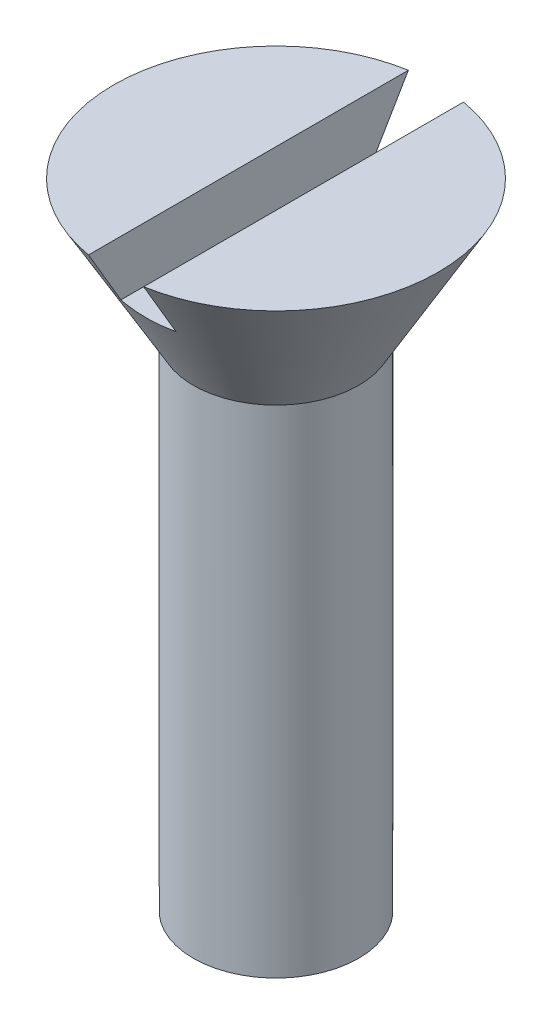
ISO-10303-21;
HEADER;
FILE_DESCRIPTION(('STEP AP214'),'2;1');
FILE_NAME('part.step','',(''),(''),'','','');
FILE_SCHEMA(('AUTOMOTIVE_DESIGN { 1 0 10303 214 1 1 1 1 }'));
ENDSEC;
DATA;
#1=APPLICATION_CONTEXT('core data for automotive mechanical design processes');
#2=APPLICATION_PROTOCOL_DEFINITION('international standard','automotive_design',2000,#1);
#3=PRODUCT_CONTEXT('',#1,'mechanical');
#4=PRODUCT('Part','Part','',(#3));
#5=PRODUCT_RELATED_PRODUCT_CATEGORY('part','',(#4));
#6=PRODUCT_DEFINITION_FORMATION('','',#4);
#7=PRODUCT_DEFINITION_CONTEXT('part definition',#1,'design');
#8=PRODUCT_DEFINITION('design','',#6,#7);
#9=PRODUCT_DEFINITION_SHAPE('','',#8);
#10=(LENGTH_UNIT() NAMED_UNIT(*) SI_UNIT(.MILLI.,.METRE.));
#11=(NAMED_UNIT(*) PLANE_ANGLE_UNIT() SI_UNIT($,.RADIAN.));
#12=(NAMED_UNIT(*) SI_UNIT($,.STERADIAN.) SOLID_ANGLE_UNIT());
#13=UNCERTAINTY_MEASURE_WITH_UNIT(LENGTH_MEASURE(1.E-05),#10,'distance_accuracy_value','');
#14=(GEOMETRIC_REPRESENTATION_CONTEXT(3) GLOBAL_UNCERTAINTY_ASSIGNED_CONTEXT((#13)) GLOBAL_UNIT_ASSIGNED_CONTEXT((#10,
#11,#12)) REPRESENTATION_CONTEXT('',''));
#15=CARTESIAN_POINT('',(0.,0.,0.));
#16=DIRECTION('',(0.,0.,1.));
#17=DIRECTION('',(1.,0.,0.));
#18=AXIS2_PLACEMENT_3D('',#15,#16,#17);
#19=CARTESIAN_POINT('',(0.,23.0000000000002,1.87350135405495E-13));
#20=DIRECTION('',(0.,-1.,0.));
#21=DIRECTION('',(0.,0.,-1.00000000000001));
#22=AXIS2_PLACEMENT_3D('',#19,#20,#21);
#23=PLANE('',#22);
#24=DIRECTION('',(0.,0.,-1.00000000000001));
#25=VECTOR('',#24,1.);
#26=CARTESIAN_POINT('',(-1.,23.0000000000002,5.88775134594868));
#27=LINE('',#26,#25);
#28=CARTESIAN_POINT('',(-1.00000000000006,23.0000000000002,5.80119310220128));
#29=VERTEX_POINT('',#28);
#30=CARTESIAN_POINT('',(-1.00000000000003,23.0000000000002,-5.80119310220077));
#31=VERTEX_POINT('',#30);
#32=EDGE_CURVE('E149',#29,#31,#27,.T.);
#33=ORIENTED_EDGE('',*,*,#32,.T.);
#34=CARTESIAN_POINT('',(0.,23.0000000000002,1.87350135405495E-13));
#35=DIRECTION('',(0.,-1.,0.));
#36=DIRECTION('',(0.,0.,-1.00000000000001));
#37=AXIS2_PLACEMENT_3D('',#34,#35,#36);
#38=CIRCLE('',#37,5.88675134594816);
#39=EDGE_CURVE('E51',#29,#31,#38,.T.);
#40=ORIENTED_EDGE('',*,*,#39,.F.);
#41=EDGE_LOOP('',(#33,#40));
#42=FACE_BOUND('',#41,.T.);
#43=ADVANCED_FACE('F42',(#42),#23,.F.);
#44=DIRECTION('',(0.,0.,-1.00000000000001));
#45=VECTOR('',#44,1.);
#46=CARTESIAN_POINT('',(1.,23.0000000000002,5.88775134594818));
#47=LINE('',#46,#45);
#48=CARTESIAN_POINT('',(0.999999999999945,23.0000000000002,5.80119310220131));
#49=VERTEX_POINT('',#48);
#50=CARTESIAN_POINT('',(1.,23.0000000000002,-5.80119310220081));
#51=VERTEX_POINT('',#50);
#52=EDGE_CURVE('E169',#49,#51,#47,.T.);
#53=ORIENTED_EDGE('',*,*,#52,.F.);
#54=EDGE_CURVE('E11',#51,#49,#38,.T.);
#55=ORIENTED_EDGE('',*,*,#54,.F.);
#56=EDGE_LOOP('',(#53,#55));
#57=FACE_BOUND('',#56,.T.);
#58=ADVANCED_FACE('F160',(#57),#23,.F.);
#59=CARTESIAN_POINT('',(0.,23.0000000000002,1.87350135405495E-13));
#60=DIRECTION('',(0.,1.,0.));
#61=DIRECTION('',(0.,0.,1.00000000000001));
#62=AXIS2_PLACEMENT_3D('',#59,#60,#61);
#63=CONICAL_SURFACE('',#62,5.88675134594816,0.523598775598304);
#64=CARTESIAN_POINT('',(0.,18.0000000000002,2.4980018054066E-13));
#65=DIRECTION('',(0.,-1.,0.));
#66=DIRECTION('',(0.,0.,-1.00000000000001));
#67=AXIS2_PLACEMENT_3D('',#64,#65,#66);
#68=CIRCLE('',#67,3.);
#69=CARTESIAN_POINT('',(0.,18.0000000000002,-2.99999999999978));
#70=VERTEX_POINT('',#69);
#71=EDGE_CURVE('E179',#70,#70,#68,.T.);
#72=ORIENTED_EDGE('',*,*,#71,.F.);
#73=EDGE_LOOP('',(#72));
#74=FACE_BOUND('',#73,.T.);
#75=CARTESIAN_POINT('',(-1.,15.9496756596478,-1.51616119676508));
#76=CARTESIAN_POINT('',(-1.00000000000002,16.0327629146096,-1.57359780048831));
#77=CARTESIAN_POINT('',(-1.00000000000003,16.1162823428286,-1.63040165709741));
#78=CARTESIAN_POINT('',(-1.00000000000003,16.2840014722308,-1.74298737685897));
#79=CARTESIAN_POINT('',(-1.00000000000003,16.3682011367729,-1.79876929453646));
#80=CARTESIAN_POINT('',(-1.00000000000003,16.5370934659947,-1.90955277492892));
#81=CARTESIAN_POINT('',(-1.00000000000003,16.621786058128,-1.96455444857528));
#82=CARTESIAN_POINT('',(-1.00000000000003,16.7915700027728,-2.07394123613671));
#83=CARTESIAN_POINT('',(-1.00000000000003,16.8766613614525,-2.12832634046981));
#84=CARTESIAN_POINT('',(-1.00000000000003,17.1323608111724,-2.29071800569782));
#85=CARTESIAN_POINT('',(-1.00000000000003,17.3034362756913,-2.39798827642144));
#86=CARTESIAN_POINT('',(-1.00000000000002,17.6464199600684,-2.61120240079285));
#87=CARTESIAN_POINT('',(-1.00000000000001,17.818328217885,-2.71714619317612));
#88=CARTESIAN_POINT('',(-0.99999999999999,18.319968605053,-3.02442281167239));
#89=CARTESIAN_POINT('',(-1.00000000000002,18.6504616079534,-3.224512420476));
#90=CARTESIAN_POINT('',(-1.00000000000004,19.3126034467591,-3.62275383145657));
#91=CARTESIAN_POINT('',(-1.00000000000003,19.6442522697673,-3.8209056551631));
#92=CARTESIAN_POINT('',(-1.00000000000003,20.3083559326735,-4.21602017403517));
#93=CARTESIAN_POINT('',(-1.00000000000003,20.6408109336901,-4.41298259829825));
#94=CARTESIAN_POINT('',(-1.00000000000002,21.3062081570767,-4.80608291276744));
#95=CARTESIAN_POINT('',(-1.00000000000001,21.6391503801146,-5.00222080184189));
#96=CARTESIAN_POINT('',(-0.999999999999994,22.4793870502628,-5.49623067311098));
#97=CARTESIAN_POINT('',(-1.00000000000002,22.9869044769734,-5.79372329827912));
#98=CARTESIAN_POINT('',(-1.00000000000004,24.002424590804,-6.38787852304444));
#99=CARTESIAN_POINT('',(-1.00000000000003,24.510427277952,-6.68454112259353));
#100=CARTESIAN_POINT('',(-1.00000000000003,25.5265427650815,-7.27718598575024));
#101=CARTESIAN_POINT('',(-1.00000000000003,26.0346554287458,-7.57316848313507));
#102=CARTESIAN_POINT('',(-1.00000000000003,27.0511133965292,-8.16473197677385));
#103=CARTESIAN_POINT('',(-1.00000000000002,27.5594587002866,-8.46031297364932));
#104=CARTESIAN_POINT('',(-1.,28.067875580662,-8.75577049508139));
#105=B_SPLINE_CURVE_WITH_KNOTS('',3,(#75,#76,#77,#78,#79,#80,#81,#82,#83,#84,#85,#86,#87,#88,
#89,#90,#91,#92,#93,#94,#95,#96,#97,#98,#99,#100,#101,#102,#103,#104),.UNSPECIFIED.,.F.,.F.,(4,
2,2,2,2,2,2,2,2,2,2,2,2,2,4),(0.,0.303012528315231,0.606008842185855,0.908961636788286,
1.21191913307806,1.81768376416724,2.42347627056562,3.58249286182722,4.74149656128886,
5.90075497241861,7.0600149740959,8.82485972986029,10.5897045878432,12.353806706096,
14.1179060903449),.UNSPECIFIED.);
#106=CARTESIAN_POINT('',(-1.,21.0000000000002,-4.62518160134425));
#107=VERTEX_POINT('',#106);
#108=EDGE_CURVE('E87',#107,#31,#105,.T.);
#109=ORIENTED_EDGE('',*,*,#108,.F.);
#110=CARTESIAN_POINT('',(0.,21.0000000000002,1.87350135405495E-13));
#111=DIRECTION('',(0.,-1.,0.));
#112=DIRECTION('',(0.,0.,-1.00000000000001));
#113=AXIS2_PLACEMENT_3D('',#110,#111,#112);
#114=CIRCLE('',#113,4.7320508075689);
#115=CARTESIAN_POINT('',(0.999999999999973,21.0000000000002,-4.6251816013442));
#116=VERTEX_POINT('',#115);
#117=EDGE_CURVE('E97',#116,#107,#114,.F.);
#118=ORIENTED_EDGE('',*,*,#117,.F.);
#119=CARTESIAN_POINT('',(1.,28.067875580662,-8.75577049508135));
#120=CARTESIAN_POINT('',(1.,27.5593175975708,-8.46023091691073));
#121=CARTESIAN_POINT('',(1.,27.0508311922605,-8.1645678559677));
#122=CARTESIAN_POINT('',(0.999999999999999,26.0341049048945,-7.57284796148646));
#123=CARTESIAN_POINT('',(0.999999999999997,25.5258650168923,-7.27679113816481));
#124=CARTESIAN_POINT('',(1.,24.5097632106478,-6.68415336457007));
#125=CARTESIAN_POINT('',(1.00000000000001,24.0019012579843,-6.38757247332671));
#126=CARTESIAN_POINT('',(0.99999999999999,22.9866493206126,-5.79357387036507));
#127=CARTESIAN_POINT('',(0.999999999999961,22.4792593481477,-5.49615613770236));
#128=CARTESIAN_POINT('',(0.999999999999979,21.718712506226,-5.04899839161846));
#129=CARTESIAN_POINT('',(0.999999999999995,21.4652613381778,-4.89975902236174));
#130=CARTESIAN_POINT('',(1.00000000000001,20.958620577571,-4.60083985677453));
#131=CARTESIAN_POINT('',(1.,20.705430983616,-4.45116006281192));
#132=CARTESIAN_POINT('',(1.,20.1994175083831,-4.15122139482165));
#133=CARTESIAN_POINT('',(1.,19.9465936040251,-4.00096255974822));
#134=CARTESIAN_POINT('',(1.,19.44142534405,-3.69962884314));
#135=CARTESIAN_POINT('',(1.,19.1890809979019,-3.54855394571358));
#136=CARTESIAN_POINT('',(1.,18.6850400625906,-3.24519819643722));
#137=CARTESIAN_POINT('',(1.,18.4333436327135,-3.09291707975157));
#138=CARTESIAN_POINT('',(1.,17.9310343004248,-2.78660173237247));
#139=CARTESIAN_POINT('',(1.,17.6804213401659,-2.63256759690989));
#140=CARTESIAN_POINT('',(1.,17.3058203422291,-2.3993231030763));
#141=CARTESIAN_POINT('',(1.,17.1811566927625,-2.32119891872858));
#142=CARTESIAN_POINT('',(1.,16.9324471478238,-2.16397973206947));
#143=CARTESIAN_POINT('',(1.,16.8084012352013,-2.08488475692382));
#144=CARTESIAN_POINT('',(1.,16.5611344818107,-1.92535916429907));
#145=CARTESIAN_POINT('',(1.,16.4379138026702,-1.8449282953259));
#146=CARTESIAN_POINT('',(1.,16.2540114320586,-1.7228690949358));
#147=CARTESIAN_POINT('',(1.00000000000001,16.1928625584043,-1.68194525126271));
#148=CARTESIAN_POINT('',(0.999999999999999,16.0709554466598,-1.599516384573));
#149=CARTESIAN_POINT('',(0.999999999999992,16.0101972200434,-1.55801134459863));
#150=CARTESIAN_POINT('',(0.999999999999973,15.9496756596478,-1.51616119676503));
#151=B_SPLINE_CURVE_WITH_KNOTS('',3,(#119,#120,#121,#122,#123,#124,#125,#126,#127,#128,#129,
#130,#131,#132,#133,#134,#135,#136,#137,#138,#139,#140,#141,#142,#143,#144,#145,#146,#147,#148,
#149,#150),.UNSPECIFIED.,.F.,.F.,(4,2,2,2,2,2,2,2,2,2,2,2,2,2,2,4),(0.,1.76458907261376,
3.52913322112413,5.29348988969741,7.05789111643699,7.94026767900738,8.82263950626304,
9.70495297478999,10.5872836874806,11.469813811798,12.3522962203107,12.7936541152619,
13.2349996876815,13.6764293109375,13.8971649160787,14.1179069751704),.UNSPECIFIED.);
#152=EDGE_CURVE('E108',#51,#116,#151,.T.);
#153=ORIENTED_EDGE('',*,*,#152,.F.);
#154=ORIENTED_EDGE('',*,*,#54,.T.);
#155=CARTESIAN_POINT('',(1.,28.0678755806616,8.7557704950814));
#156=CARTESIAN_POINT('',(1.,27.5593175975704,8.46023091691085));
#157=CARTESIAN_POINT('',(1.,27.0508311922601,8.16456785596784));
#158=CARTESIAN_POINT('',(0.999999999999999,26.0341049048942,7.57284796148663));
#159=CARTESIAN_POINT('',(0.999999999999997,25.525865016892,7.27679113816499));
#160=CARTESIAN_POINT('',(1.,24.5097632106476,6.68415336457031));
#161=CARTESIAN_POINT('',(1.00000000000001,24.001901257984,6.38757247332702));
#162=CARTESIAN_POINT('',(0.99999999999999,22.9866493206124,5.79357387036527));
#163=CARTESIAN_POINT('',(0.999999999999961,22.4792593481477,5.49615613770239));
#164=CARTESIAN_POINT('',(0.999999999999979,21.7187125062259,5.04899839161863));
#165=CARTESIAN_POINT('',(0.999999999999995,21.4652613381777,4.89975902236201));
#166=CARTESIAN_POINT('',(1.00000000000001,20.9586205775709,4.60083985677488));
#167=CARTESIAN_POINT('',(1.,20.7054309836158,4.45116006281223));
#168=CARTESIAN_POINT('',(1.,20.199417508383,4.15122139482195));
#169=CARTESIAN_POINT('',(1.,19.946593604025,4.00096255974853));
#170=CARTESIAN_POINT('',(1.,19.4414253440499,3.69962884314031));
#171=CARTESIAN_POINT('',(1.,19.1890809979018,3.54855394571389));
#172=CARTESIAN_POINT('',(1.,18.6850400625905,3.24519819643753));
#173=CARTESIAN_POINT('',(1.,18.4333436327134,3.09291707975188));
#174=CARTESIAN_POINT('',(1.,17.9310343004247,2.78660173237278));
#175=CARTESIAN_POINT('',(1.,17.6804213401658,2.63256759691019));
#176=CARTESIAN_POINT('',(1.,17.3058203422289,2.3993231030766));
#177=CARTESIAN_POINT('',(1.,17.1811566927624,2.32119891872889));
#178=CARTESIAN_POINT('',(1.,16.9324471478237,2.16397973206978));
#179=CARTESIAN_POINT('',(1.,16.8084012352011,2.08488475692412));
#180=CARTESIAN_POINT('',(1.,16.5611344818106,1.92535916429937));
#181=CARTESIAN_POINT('',(1.,16.4379138026701,1.84492829532619));
#182=CARTESIAN_POINT('',(1.,16.2540114320585,1.7228690949361));
#183=CARTESIAN_POINT('',(1.00000000000001,16.1928625584042,1.68194525126302));
#184=CARTESIAN_POINT('',(0.999999999999999,16.0709554466597,1.59951638457328));
#185=CARTESIAN_POINT('',(0.999999999999992,16.0101972200434,1.55801134459887));
#186=CARTESIAN_POINT('',(0.999999999999973,15.9496756596478,1.51616119676515));
#187=B_SPLINE_CURVE_WITH_KNOTS('',3,(#155,#156,#157,#158,#159,#160,#161,#162,#163,#164,#165,
#166,#167,#168,#169,#170,#171,#172,#173,#174,#175,#176,#177,#178,#179,#180,#181,#182,#183,#184,
#185,#186),.UNSPECIFIED.,.F.,.F.,(4,2,2,2,2,2,2,2,2,2,2,2,2,2,2,4),(0.,1.76458907261366,
3.52913322112393,5.29348988969711,7.0578911164366,7.94026767900699,8.82263950626266,
9.7049529747896,10.5872836874802,11.4698138117976,12.3522962203103,12.7936541152615,
13.2349996876811,13.6764293109371,13.8971649160783,14.11790697517),.UNSPECIFIED.);
#188=CARTESIAN_POINT('',(0.999999999999945,21.0000000000002,4.62518160134477));
#189=VERTEX_POINT('',#188);
#190=EDGE_CURVE('E102',#49,#189,#187,.T.);
#191=ORIENTED_EDGE('',*,*,#190,.T.);
#192=CARTESIAN_POINT('',(0.,21.0000000000002,1.87350135405495E-13));
#193=DIRECTION('',(0.,1.,0.));
#194=DIRECTION('',(0.,0.,1.00000000000001));
#195=AXIS2_PLACEMENT_3D('',#192,#193,#194);
#196=CIRCLE('',#195,4.7320508075689);
#197=CARTESIAN_POINT('',(-1.00000000000003,21.0000000000002,4.62518160134449));
#198=VERTEX_POINT('',#197);
#199=EDGE_CURVE('E150',#189,#198,#196,.F.);
#200=ORIENTED_EDGE('',*,*,#199,.T.);
#201=CARTESIAN_POINT('',(-1.0000000000002,15.9496756596478,1.51616119676541));
#202=CARTESIAN_POINT('',(-1.00000000000007,16.0327629146096,1.57359780048867));
#203=CARTESIAN_POINT('',(-1.00000000000002,16.1162823428286,1.63040165709777));
#204=CARTESIAN_POINT('',(-0.999999999999982,16.2840014722307,1.74298737685933));
#205=CARTESIAN_POINT('',(-0.999999999999995,16.3682011367728,1.79876929453682));
#206=CARTESIAN_POINT('',(-1.00000000000001,16.5370934659946,1.90955277492927));
#207=CARTESIAN_POINT('',(-1.,16.6217860581279,1.96455444857563));
#208=CARTESIAN_POINT('',(-0.999999999999999,16.7915700027727,2.07394123613706));
#209=CARTESIAN_POINT('',(-1.,16.8766613614524,2.12832634047015));
#210=CARTESIAN_POINT('',(-0.999999999999999,17.1323608111723,2.29071800569816));
#211=CARTESIAN_POINT('',(-0.999999999999989,17.3034362756912,2.39798827642181));
#212=CARTESIAN_POINT('',(-1.00000000000001,17.6464199600683,2.61120240079313));
#213=CARTESIAN_POINT('',(-1.00000000000004,17.818328217885,2.71714619317627));
#214=CARTESIAN_POINT('',(-1.00000000000008,18.3199686050531,3.02442281167243));
#215=CARTESIAN_POINT('',(-1.00000000000002,18.6504616079533,3.22451242047625));
#216=CARTESIAN_POINT('',(-0.999999999999981,19.312603446759,3.62275383145698));
#217=CARTESIAN_POINT('',(-1.,19.6442522697673,3.82090565516347));
#218=CARTESIAN_POINT('',(-1.,20.3083559326735,4.2160201740355));
#219=CARTESIAN_POINT('',(-0.999999999999983,20.6408109336901,4.41298259829861));
#220=CARTESIAN_POINT('',(-1.00000000000002,21.3062081570767,4.80608291276783));
#221=CARTESIAN_POINT('',(-1.00000000000007,21.6391503801146,5.00222080184229));
#222=CARTESIAN_POINT('',(-1.0000000000001,22.4793870502627,5.49623067311137));
#223=CARTESIAN_POINT('',(-1.00000000000003,22.9869044769733,5.79372329827947));
#224=CARTESIAN_POINT('',(-0.999999999999973,24.0024245908038,6.38787852304472));
#225=CARTESIAN_POINT('',(-0.999999999999993,24.5104272779518,6.6845411225938));
#226=CARTESIAN_POINT('',(-1.00000000000001,25.5265427650812,7.27718598575046));
#227=CARTESIAN_POINT('',(-1.00000000000001,26.0346554287455,7.57316848313528));
#228=CARTESIAN_POINT('',(-0.999999999999997,27.0511133965288,8.164731976774));
#229=CARTESIAN_POINT('',(-0.999999999999993,27.5594587002862,8.46031297364943));
#230=CARTESIAN_POINT('',(-1.,28.0678755806616,8.75577049508142));
#231=B_SPLINE_CURVE_WITH_KNOTS('',3,(#201,#202,#203,#204,#205,#206,#207,#208,#209,#210,#211,
#212,#213,#214,#215,#216,#217,#218,#219,#220,#221,#222,#223,#224,#225,#226,#227,#228,#229,#230),
.UNSPECIFIED.,.F.,.F.,(4,2,2,2,2,2,2,2,2,2,2,2,2,2,4),(0.,0.303012528315217,0.606008842185825,
0.908961636788243,1.211919133078,1.81768376416715,2.4234762705655,3.58249286182715,
4.74149656128882,5.90075497241861,7.06001497409594,8.82485972986019,10.589704587843,
12.3538067060956,14.1179060903444),.UNSPECIFIED.);
#232=EDGE_CURVE('E90',#198,#29,#231,.T.);
#233=ORIENTED_EDGE('',*,*,#232,.T.);
#234=ORIENTED_EDGE('',*,*,#39,.T.);
#235=EDGE_LOOP('',(#109,#118,#153,#154,#191,#200,#233,#234));
#236=FACE_BOUND('',#235,.T.);
#237=ADVANCED_FACE('F105',(#74,#236),#63,.T.);
#238=CARTESIAN_POINT('',(0.,0.,0.));
#239=DIRECTION('',(0.,1.,0.));
#240=DIRECTION('',(0.,0.,1.00000000000001));
#241=AXIS2_PLACEMENT_3D('',#238,#239,#240);
#242=CONICAL_SURFACE('',#241,3.,1.04719755119659);
#243=CARTESIAN_POINT('',(0.,-1.7320508075689,0.));
#244=VERTEX_POINT('',#243);
#245=VERTEX_LOOP('',#244);
#246=FACE_BOUND('',#245,.T.);
#247=CARTESIAN_POINT('',(0.,0.,0.));
#248=DIRECTION('',(0.,-1.,0.));
#249=DIRECTION('',(0.,0.,-1.00000000000001));
#250=AXIS2_PLACEMENT_3D('',#247,#248,#249);
#251=CIRCLE('',#250,3.);
#252=CARTESIAN_POINT('',(0.,0.,-3.00000000000003));
#253=VERTEX_POINT('',#252);
#254=EDGE_CURVE('E94',#253,#253,#251,.T.);
#255=ORIENTED_EDGE('',*,*,#254,.T.);
#256=EDGE_LOOP('',(#255));
#257=FACE_BOUND('',#256,.T.);
#258=ADVANCED_FACE('F44',(#246,#257),#242,.T.);
#259=CARTESIAN_POINT('',(0.,0.,0.));
#260=DIRECTION('',(0.,-1.,0.));
#261=DIRECTION('',(0.,0.,-1.00000000000001));
#262=AXIS2_PLACEMENT_3D('',#259,#260,#261);
#263=CYLINDRICAL_SURFACE('',#262,3.);
#264=ORIENTED_EDGE('',*,*,#254,.F.);
#265=EDGE_LOOP('',(#264));
#266=FACE_BOUND('',#265,.T.);
#267=ORIENTED_EDGE('',*,*,#71,.T.);
#268=EDGE_LOOP('',(#267));
#269=FACE_BOUND('',#268,.T.);
#270=ADVANCED_FACE('F155',(#266,#269),#263,.T.);
#271=CARTESIAN_POINT('',(-1.,23.0000000000002,5.88775134594868));
#272=DIRECTION('',(1.00000000000001,0.,0.));
#273=DIRECTION('',(0.,1.,0.));
#274=AXIS2_PLACEMENT_3D('',#271,#272,#273);
#275=PLANE('',#274);
#276=DIRECTION('',(0.,0.,-1.00000000000001));
#277=VECTOR('',#276,1.);
#278=CARTESIAN_POINT('',(-1.,21.0000000000002,5.88775134594866));
#279=LINE('',#278,#277);
#280=EDGE_CURVE('E83',#198,#107,#279,.T.);
#281=ORIENTED_EDGE('',*,*,#280,.T.);
#282=ORIENTED_EDGE('',*,*,#108,.T.);
#283=ORIENTED_EDGE('',*,*,#32,.F.);
#284=ORIENTED_EDGE('',*,*,#232,.F.);
#285=EDGE_LOOP('',(#281,#282,#283,#284));
#286=FACE_BOUND('',#285,.T.);
#287=ADVANCED_FACE('F85',(#286),#275,.T.);
#288=CARTESIAN_POINT('',(-1.,21.0000000000002,5.88775134594866));
#289=DIRECTION('',(0.,1.,0.));
#290=DIRECTION('',(0.,0.,1.00000000000001));
#291=AXIS2_PLACEMENT_3D('',#288,#289,#290);
#292=PLANE('',#291);
#293=DIRECTION('',(0.,0.,-1.00000000000001));
#294=VECTOR('',#293,1.);
#295=CARTESIAN_POINT('',(1.,21.0000000000002,5.88775134594818));
#296=LINE('',#295,#294);
#297=EDGE_CURVE('E58',#189,#116,#296,.T.);
#298=ORIENTED_EDGE('',*,*,#297,.T.);
#299=ORIENTED_EDGE('',*,*,#117,.T.);
#300=ORIENTED_EDGE('',*,*,#280,.F.);
#301=ORIENTED_EDGE('',*,*,#199,.F.);
#302=EDGE_LOOP('',(#298,#299,#300,#301));
#303=FACE_BOUND('',#302,.T.);
#304=ADVANCED_FACE('F98',(#303),#292,.T.);
#305=CARTESIAN_POINT('',(1.,23.0000000000002,5.88775134594818));
#306=DIRECTION('',(-1.00000000000001,0.,0.));
#307=DIRECTION('',(0.,-1.,0.));
#308=AXIS2_PLACEMENT_3D('',#305,#306,#307);
#309=PLANE('',#308);
#310=ORIENTED_EDGE('',*,*,#52,.T.);
#311=ORIENTED_EDGE('',*,*,#152,.T.);
#312=ORIENTED_EDGE('',*,*,#297,.F.);
#313=ORIENTED_EDGE('',*,*,#190,.F.);
#314=EDGE_LOOP('',(#310,#311,#312,#313));
#315=FACE_BOUND('',#314,.T.);
#316=ADVANCED_FACE('F132',(#315),#309,.T.);
#317=CLOSED_SHELL('',(#43,#58,#237,#258,#270,#287,#304,#316));
#318=MANIFOLD_SOLID_BREP('B2',#317);
#319=ADVANCED_BREP_SHAPE_REPRESENTATION('',(#18,#318),#14);
#320=SHAPE_DEFINITION_REPRESENTATION(#9,#319);
ENDSEC;
END-ISO-10303-21;
